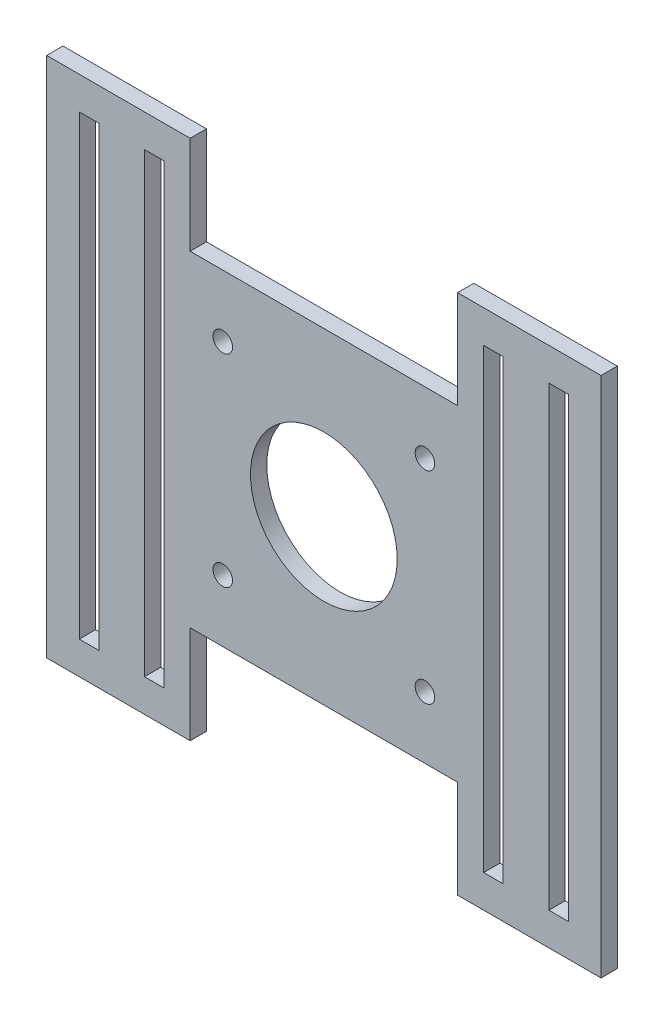
ISO-10303-21;
HEADER;
FILE_DESCRIPTION(('STEP AP214'),'2;1');
FILE_NAME('part.step','',(''),(''),'','','');
FILE_SCHEMA(('AUTOMOTIVE_DESIGN { 1 0 10303 214 1 1 1 1 }'));
ENDSEC;
DATA;
#1=APPLICATION_CONTEXT('core data for automotive mechanical design processes');
#2=APPLICATION_PROTOCOL_DEFINITION('international standard','automotive_design',2000,#1);
#3=PRODUCT_CONTEXT('',#1,'mechanical');
#4=PRODUCT('Part','Part','',(#3));
#5=PRODUCT_RELATED_PRODUCT_CATEGORY('part','',(#4));
#6=PRODUCT_DEFINITION_FORMATION('','',#4);
#7=PRODUCT_DEFINITION_CONTEXT('part definition',#1,'design');
#8=PRODUCT_DEFINITION('design','',#6,#7);
#9=PRODUCT_DEFINITION_SHAPE('','',#8);
#10=(LENGTH_UNIT() NAMED_UNIT(*) SI_UNIT(.MILLI.,.METRE.));
#11=(NAMED_UNIT(*) PLANE_ANGLE_UNIT() SI_UNIT($,.RADIAN.));
#12=(NAMED_UNIT(*) SI_UNIT($,.STERADIAN.) SOLID_ANGLE_UNIT());
#13=UNCERTAINTY_MEASURE_WITH_UNIT(LENGTH_MEASURE(1.E-05),#10,'distance_accuracy_value','');
#14=(GEOMETRIC_REPRESENTATION_CONTEXT(3) GLOBAL_UNCERTAINTY_ASSIGNED_CONTEXT((#13)) GLOBAL_UNIT_ASSIGNED_CONTEXT((#10,
#11,#12)) REPRESENTATION_CONTEXT('',''));
#15=CARTESIAN_POINT('',(0.,0.,0.));
#16=DIRECTION('',(0.,0.,1.));
#17=DIRECTION('',(1.,0.,0.));
#18=AXIS2_PLACEMENT_3D('',#15,#16,#17);
#19=CARTESIAN_POINT('',(0.,0.,2.5));
#20=DIRECTION('',(0.,1.,0.));
#21=DIRECTION('',(0.,0.,1.));
#22=AXIS2_PLACEMENT_3D('',#19,#20,#21);
#23=PLANE('',#22);
#24=DIRECTION('',(0.,0.,-1.));
#25=VECTOR('',#24,1.);
#26=CARTESIAN_POINT('',(63.,0.,2.5));
#27=LINE('',#26,#25);
#28=CARTESIAN_POINT('',(63.,0.,2.5));
#29=VERTEX_POINT('',#28);
#30=CARTESIAN_POINT('',(63.,0.,0.));
#31=VERTEX_POINT('',#30);
#32=EDGE_CURVE('E369',#29,#31,#27,.T.);
#33=ORIENTED_EDGE('',*,*,#32,.F.);
#34=DIRECTION('',(1.,0.,0.));
#35=VECTOR('',#34,1.);
#36=CARTESIAN_POINT('',(0.,0.,2.5));
#37=LINE('',#36,#35);
#38=CARTESIAN_POINT('',(22.,0.,2.5));
#39=VERTEX_POINT('',#38);
#40=EDGE_CURVE('E397',#39,#29,#37,.T.);
#41=ORIENTED_EDGE('',*,*,#40,.F.);
#42=DIRECTION('',(0.,0.,-1.));
#43=VECTOR('',#42,1.);
#44=CARTESIAN_POINT('',(22.,0.,2.5));
#45=LINE('',#44,#43);
#46=CARTESIAN_POINT('',(22.,0.,0.));
#47=VERTEX_POINT('',#46);
#48=EDGE_CURVE('E393',#39,#47,#45,.T.);
#49=ORIENTED_EDGE('',*,*,#48,.T.);
#50=DIRECTION('',(1.,0.,0.));
#51=VECTOR('',#50,1.);
#52=CARTESIAN_POINT('',(0.,0.,0.));
#53=LINE('',#52,#51);
#54=EDGE_CURVE('E524',#47,#31,#53,.T.);
#55=ORIENTED_EDGE('',*,*,#54,.T.);
#56=EDGE_LOOP('',(#33,#41,#49,#55));
#57=FACE_BOUND('',#56,.T.);
#58=ADVANCED_FACE('F39',(#57),#23,.F.);
#59=CARTESIAN_POINT('',(0.,50.,2.5));
#60=DIRECTION('',(0.,-1.,0.));
#61=DIRECTION('',(0.,0.,-1.));
#62=AXIS2_PLACEMENT_3D('',#59,#60,#61);
#63=PLANE('',#62);
#64=DIRECTION('',(0.,0.,-1.));
#65=VECTOR('',#64,1.);
#66=CARTESIAN_POINT('',(63.,50.,2.5));
#67=LINE('',#66,#65);
#68=CARTESIAN_POINT('',(63.,50.,2.5));
#69=VERTEX_POINT('',#68);
#70=CARTESIAN_POINT('',(63.,50.,0.));
#71=VERTEX_POINT('',#70);
#72=EDGE_CURVE('E494',#69,#71,#67,.T.);
#73=ORIENTED_EDGE('',*,*,#72,.T.);
#74=DIRECTION('',(-1.,0.,0.));
#75=VECTOR('',#74,1.);
#76=CARTESIAN_POINT('',(0.,50.,0.));
#77=LINE('',#76,#75);
#78=CARTESIAN_POINT('',(22.,50.,0.));
#79=VERTEX_POINT('',#78);
#80=EDGE_CURVE('E467',#71,#79,#77,.T.);
#81=ORIENTED_EDGE('',*,*,#80,.T.);
#82=DIRECTION('',(0.,0.,-1.));
#83=VECTOR('',#82,1.);
#84=CARTESIAN_POINT('',(22.,50.,2.5));
#85=LINE('',#84,#83);
#86=CARTESIAN_POINT('',(22.,50.,2.5));
#87=VERTEX_POINT('',#86);
#88=EDGE_CURVE('E508',#87,#79,#85,.T.);
#89=ORIENTED_EDGE('',*,*,#88,.F.);
#90=DIRECTION('',(-1.,0.,0.));
#91=VECTOR('',#90,1.);
#92=CARTESIAN_POINT('',(0.,50.,2.5));
#93=LINE('',#92,#91);
#94=EDGE_CURVE('E11',#69,#87,#93,.T.);
#95=ORIENTED_EDGE('',*,*,#94,.F.);
#96=EDGE_LOOP('',(#73,#81,#89,#95));
#97=FACE_BOUND('',#96,.T.);
#98=ADVANCED_FACE('F561',(#97),#63,.F.);
#99=CARTESIAN_POINT('',(0.,0.,2.5));
#100=DIRECTION('',(1.,0.,0.));
#101=DIRECTION('',(0.,0.,-1.));
#102=AXIS2_PLACEMENT_3D('',#99,#100,#101);
#103=PLANE('',#102);
#104=DIRECTION('',(0.,-1.,0.));
#105=VECTOR('',#104,1.);
#106=CARTESIAN_POINT('',(0.,0.,0.));
#107=LINE('',#106,#105);
#108=CARTESIAN_POINT('',(0.,65.,0.));
#109=VERTEX_POINT('',#108);
#110=CARTESIAN_POINT('',(0.,-15.,0.));
#111=VERTEX_POINT('',#110);
#112=EDGE_CURVE('E475',#109,#111,#107,.T.);
#113=ORIENTED_EDGE('',*,*,#112,.T.);
#114=DIRECTION('',(0.,0.,-1.));
#115=VECTOR('',#114,1.);
#116=CARTESIAN_POINT('',(0.,-15.,2.5));
#117=LINE('',#116,#115);
#118=CARTESIAN_POINT('',(0.,-15.,2.5));
#119=VERTEX_POINT('',#118);
#120=EDGE_CURVE('E472',#119,#111,#117,.T.);
#121=ORIENTED_EDGE('',*,*,#120,.F.);
#122=DIRECTION('',(0.,-1.,0.));
#123=VECTOR('',#122,1.);
#124=CARTESIAN_POINT('',(0.,0.,2.5));
#125=LINE('',#124,#123);
#126=CARTESIAN_POINT('',(0.,65.,2.5));
#127=VERTEX_POINT('',#126);
#128=EDGE_CURVE('E458',#127,#119,#125,.T.);
#129=ORIENTED_EDGE('',*,*,#128,.F.);
#130=DIRECTION('',(0.,0.,-1.));
#131=VECTOR('',#130,1.);
#132=CARTESIAN_POINT('',(0.,65.,2.5));
#133=LINE('',#132,#131);
#134=EDGE_CURVE('E499',#127,#109,#133,.T.);
#135=ORIENTED_EDGE('',*,*,#134,.T.);
#136=EDGE_LOOP('',(#113,#121,#129,#135));
#137=FACE_BOUND('',#136,.T.);
#138=ADVANCED_FACE('F41',(#137),#103,.F.);
#139=CARTESIAN_POINT('',(85.,0.,2.5));
#140=DIRECTION('',(-1.,0.,0.));
#141=DIRECTION('',(0.,0.,1.));
#142=AXIS2_PLACEMENT_3D('',#139,#140,#141);
#143=PLANE('',#142);
#144=DIRECTION('',(0.,1.,0.));
#145=VECTOR('',#144,1.);
#146=CARTESIAN_POINT('',(85.,0.,0.));
#147=LINE('',#146,#145);
#148=CARTESIAN_POINT('',(85.,-15.,0.));
#149=VERTEX_POINT('',#148);
#150=CARTESIAN_POINT('',(85.,65.,0.));
#151=VERTEX_POINT('',#150);
#152=EDGE_CURVE('E522',#149,#151,#147,.T.);
#153=ORIENTED_EDGE('',*,*,#152,.T.);
#154=DIRECTION('',(0.,0.,-1.));
#155=VECTOR('',#154,1.);
#156=CARTESIAN_POINT('',(85.,65.,2.5));
#157=LINE('',#156,#155);
#158=CARTESIAN_POINT('',(85.,65.,2.5));
#159=VERTEX_POINT('',#158);
#160=EDGE_CURVE('E491',#159,#151,#157,.T.);
#161=ORIENTED_EDGE('',*,*,#160,.F.);
#162=DIRECTION('',(0.,1.,0.));
#163=VECTOR('',#162,1.);
#164=CARTESIAN_POINT('',(85.,0.,2.5));
#165=LINE('',#164,#163);
#166=CARTESIAN_POINT('',(85.,-15.,2.5));
#167=VERTEX_POINT('',#166);
#168=EDGE_CURVE('E48',#167,#159,#165,.T.);
#169=ORIENTED_EDGE('',*,*,#168,.F.);
#170=DIRECTION('',(0.,0.,-1.));
#171=VECTOR('',#170,1.);
#172=CARTESIAN_POINT('',(85.,-15.,2.5));
#173=LINE('',#172,#171);
#174=EDGE_CURVE('E376',#167,#149,#173,.T.);
#175=ORIENTED_EDGE('',*,*,#174,.T.);
#176=EDGE_LOOP('',(#153,#161,#169,#175));
#177=FACE_BOUND('',#176,.T.);
#178=ADVANCED_FACE('F437',(#177),#143,.F.);
#179=CARTESIAN_POINT('',(0.,0.,2.5));
#180=DIRECTION('',(0.,0.,-1.));
#181=DIRECTION('',(-1.,0.,0.));
#182=AXIS2_PLACEMENT_3D('',#179,#180,#181);
#183=PLANE('',#182);
#184=CARTESIAN_POINT('',(58.,9.5,2.5));
#185=DIRECTION('',(0.,0.,1.));
#186=DIRECTION('',(1.,0.,0.));
#187=AXIS2_PLACEMENT_3D('',#184,#185,#186);
#188=CIRCLE('',#187,1.5);
#189=CARTESIAN_POINT('',(59.5,9.5,2.5));
#190=VERTEX_POINT('',#189);
#191=EDGE_CURVE('E427',#190,#190,#188,.T.);
#192=ORIENTED_EDGE('',*,*,#191,.F.);
#193=EDGE_LOOP('',(#192));
#194=FACE_BOUND('',#193,.T.);
#195=CARTESIAN_POINT('',(58.,40.5,2.5));
#196=DIRECTION('',(0.,0.,1.));
#197=DIRECTION('',(1.,0.,0.));
#198=AXIS2_PLACEMENT_3D('',#195,#196,#197);
#199=CIRCLE('',#198,1.5);
#200=CARTESIAN_POINT('',(59.5,40.5,2.5));
#201=VERTEX_POINT('',#200);
#202=EDGE_CURVE('E417',#201,#201,#199,.T.);
#203=ORIENTED_EDGE('',*,*,#202,.F.);
#204=EDGE_LOOP('',(#203));
#205=FACE_BOUND('',#204,.T.);
#206=CARTESIAN_POINT('',(27.,9.5,2.5));
#207=DIRECTION('',(0.,0.,1.));
#208=DIRECTION('',(1.,0.,0.));
#209=AXIS2_PLACEMENT_3D('',#206,#207,#208);
#210=CIRCLE('',#209,1.5);
#211=CARTESIAN_POINT('',(28.5,9.5,2.5));
#212=VERTEX_POINT('',#211);
#213=EDGE_CURVE('E414',#212,#212,#210,.T.);
#214=ORIENTED_EDGE('',*,*,#213,.F.);
#215=EDGE_LOOP('',(#214));
#216=FACE_BOUND('',#215,.T.);
#217=CARTESIAN_POINT('',(27.,40.5,2.5));
#218=DIRECTION('',(0.,0.,1.));
#219=DIRECTION('',(1.,0.,0.));
#220=AXIS2_PLACEMENT_3D('',#217,#218,#219);
#221=CIRCLE('',#220,1.5);
#222=CARTESIAN_POINT('',(28.5,40.5,2.5));
#223=VERTEX_POINT('',#222);
#224=EDGE_CURVE('E411',#223,#223,#221,.T.);
#225=ORIENTED_EDGE('',*,*,#224,.F.);
#226=EDGE_LOOP('',(#225));
#227=FACE_BOUND('',#226,.T.);
#228=CARTESIAN_POINT('',(42.5,25.,2.5));
#229=DIRECTION('',(0.,0.,1.));
#230=DIRECTION('',(1.,0.,0.));
#231=AXIS2_PLACEMENT_3D('',#228,#229,#230);
#232=CIRCLE('',#231,11.25);
#233=CARTESIAN_POINT('',(53.75,25.,2.5));
#234=VERTEX_POINT('',#233);
#235=EDGE_CURVE('E249',#234,#234,#232,.T.);
#236=ORIENTED_EDGE('',*,*,#235,.F.);
#237=EDGE_LOOP('',(#236));
#238=FACE_BOUND('',#237,.T.);
#239=DIRECTION('',(1.,0.,0.));
#240=VECTOR('',#239,1.);
#241=CARTESIAN_POINT('',(77.,-10.,2.5));
#242=LINE('',#241,#240);
#243=CARTESIAN_POINT('',(77.,-10.,2.5));
#244=VERTEX_POINT('',#243);
#245=CARTESIAN_POINT('',(80.,-10.,2.5));
#246=VERTEX_POINT('',#245);
#247=EDGE_CURVE('E255',#244,#246,#242,.T.);
#248=ORIENTED_EDGE('',*,*,#247,.F.);
#249=DIRECTION('',(0.,-1.,0.));
#250=VECTOR('',#249,1.);
#251=CARTESIAN_POINT('',(77.,-10.,2.5));
#252=LINE('',#251,#250);
#253=CARTESIAN_POINT('',(77.,60.,2.5));
#254=VERTEX_POINT('',#253);
#255=EDGE_CURVE('E56',#254,#244,#252,.T.);
#256=ORIENTED_EDGE('',*,*,#255,.F.);
#257=DIRECTION('',(-1.,0.,0.));
#258=VECTOR('',#257,1.);
#259=CARTESIAN_POINT('',(77.,60.,2.5));
#260=LINE('',#259,#258);
#261=CARTESIAN_POINT('',(80.,60.,2.5));
#262=VERTEX_POINT('',#261);
#263=EDGE_CURVE('E243',#262,#254,#260,.T.);
#264=ORIENTED_EDGE('',*,*,#263,.F.);
#265=DIRECTION('',(0.,1.,0.));
#266=VECTOR('',#265,1.);
#267=CARTESIAN_POINT('',(80.,-10.,2.5));
#268=LINE('',#267,#266);
#269=EDGE_CURVE('E246',#246,#262,#268,.T.);
#270=ORIENTED_EDGE('',*,*,#269,.F.);
#271=EDGE_LOOP('',(#248,#256,#264,#270));
#272=FACE_BOUND('',#271,.T.);
#273=DIRECTION('',(1.,0.,0.));
#274=VECTOR('',#273,1.);
#275=CARTESIAN_POINT('',(67.,-10.,2.5));
#276=LINE('',#275,#274);
#277=CARTESIAN_POINT('',(67.,-10.,2.5));
#278=VERTEX_POINT('',#277);
#279=CARTESIAN_POINT('',(70.,-10.,2.5));
#280=VERTEX_POINT('',#279);
#281=EDGE_CURVE('E281',#278,#280,#276,.T.);
#282=ORIENTED_EDGE('',*,*,#281,.F.);
#283=DIRECTION('',(0.,-1.,0.));
#284=VECTOR('',#283,1.);
#285=CARTESIAN_POINT('',(67.,60.,2.5));
#286=LINE('',#285,#284);
#287=CARTESIAN_POINT('',(67.,60.,2.5));
#288=VERTEX_POINT('',#287);
#289=EDGE_CURVE('E262',#288,#278,#286,.T.);
#290=ORIENTED_EDGE('',*,*,#289,.F.);
#291=DIRECTION('',(-1.,0.,0.));
#292=VECTOR('',#291,1.);
#293=CARTESIAN_POINT('',(67.,60.,2.5));
#294=LINE('',#293,#292);
#295=CARTESIAN_POINT('',(70.,60.,2.5));
#296=VERTEX_POINT('',#295);
#297=EDGE_CURVE('E270',#296,#288,#294,.T.);
#298=ORIENTED_EDGE('',*,*,#297,.F.);
#299=DIRECTION('',(0.,1.,0.));
#300=VECTOR('',#299,1.);
#301=CARTESIAN_POINT('',(70.,60.,2.5));
#302=LINE('',#301,#300);
#303=EDGE_CURVE('E284',#280,#296,#302,.T.);
#304=ORIENTED_EDGE('',*,*,#303,.F.);
#305=EDGE_LOOP('',(#282,#290,#298,#304));
#306=FACE_BOUND('',#305,.T.);
#307=DIRECTION('',(1.,0.,0.));
#308=VECTOR('',#307,1.);
#309=CARTESIAN_POINT('',(15.,-10.,2.5));
#310=LINE('',#309,#308);
#311=CARTESIAN_POINT('',(15.,-10.,2.5));
#312=VERTEX_POINT('',#311);
#313=CARTESIAN_POINT('',(18.,-10.,2.5));
#314=VERTEX_POINT('',#313);
#315=EDGE_CURVE('E313',#312,#314,#310,.T.);
#316=ORIENTED_EDGE('',*,*,#315,.F.);
#317=DIRECTION('',(0.,-1.,0.));
#318=VECTOR('',#317,1.);
#319=CARTESIAN_POINT('',(15.,-10.,2.5));
#320=LINE('',#319,#318);
#321=CARTESIAN_POINT('',(15.,60.,2.5));
#322=VERTEX_POINT('',#321);
#323=EDGE_CURVE('E291',#322,#312,#320,.T.);
#324=ORIENTED_EDGE('',*,*,#323,.F.);
#325=DIRECTION('',(-1.,0.,0.));
#326=VECTOR('',#325,1.);
#327=CARTESIAN_POINT('',(15.,60.,2.5));
#328=LINE('',#327,#326);
#329=CARTESIAN_POINT('',(18.,60.,2.5));
#330=VERTEX_POINT('',#329);
#331=EDGE_CURVE('E302',#330,#322,#328,.T.);
#332=ORIENTED_EDGE('',*,*,#331,.F.);
#333=DIRECTION('',(0.,1.,0.));
#334=VECTOR('',#333,1.);
#335=CARTESIAN_POINT('',(18.,-10.,2.5));
#336=LINE('',#335,#334);
#337=EDGE_CURVE('E316',#314,#330,#336,.T.);
#338=ORIENTED_EDGE('',*,*,#337,.F.);
#339=EDGE_LOOP('',(#316,#324,#332,#338));
#340=FACE_BOUND('',#339,.T.);
#341=DIRECTION('',(1.,0.,0.));
#342=VECTOR('',#341,1.);
#343=CARTESIAN_POINT('',(5.00000000000001,-10.,2.5));
#344=LINE('',#343,#342);
#345=CARTESIAN_POINT('',(5.00000000000001,-10.,2.5));
#346=VERTEX_POINT('',#345);
#347=CARTESIAN_POINT('',(8.00000000000001,-10.,2.5));
#348=VERTEX_POINT('',#347);
#349=EDGE_CURVE('E345',#346,#348,#344,.T.);
#350=ORIENTED_EDGE('',*,*,#349,.F.);
#351=DIRECTION('',(0.,-1.,0.));
#352=VECTOR('',#351,1.);
#353=CARTESIAN_POINT('',(5.,60.,2.5));
#354=LINE('',#353,#352);
#355=CARTESIAN_POINT('',(5.,60.,2.5));
#356=VERTEX_POINT('',#355);
#357=EDGE_CURVE('E323',#356,#346,#354,.T.);
#358=ORIENTED_EDGE('',*,*,#357,.F.);
#359=DIRECTION('',(-1.,0.,0.));
#360=VECTOR('',#359,1.);
#361=CARTESIAN_POINT('',(5.,60.,2.5));
#362=LINE('',#361,#360);
#363=CARTESIAN_POINT('',(8.,60.,2.5));
#364=VERTEX_POINT('',#363);
#365=EDGE_CURVE('E334',#364,#356,#362,.T.);
#366=ORIENTED_EDGE('',*,*,#365,.F.);
#367=DIRECTION('',(0.,1.,0.));
#368=VECTOR('',#367,1.);
#369=CARTESIAN_POINT('',(8.,60.,2.5));
#370=LINE('',#369,#368);
#371=EDGE_CURVE('E348',#348,#364,#370,.T.);
#372=ORIENTED_EDGE('',*,*,#371,.F.);
#373=EDGE_LOOP('',(#350,#358,#366,#372));
#374=FACE_BOUND('',#373,.T.);
#375=ORIENTED_EDGE('',*,*,#128,.T.);
#376=DIRECTION('',(1.,0.,0.));
#377=VECTOR('',#376,1.);
#378=CARTESIAN_POINT('',(0.,-15.,2.5));
#379=LINE('',#378,#377);
#380=CARTESIAN_POINT('',(22.,-15.,2.5));
#381=VERTEX_POINT('',#380);
#382=EDGE_CURVE('E383',#119,#381,#379,.T.);
#383=ORIENTED_EDGE('',*,*,#382,.T.);
#384=DIRECTION('',(0.,1.,0.));
#385=VECTOR('',#384,1.);
#386=CARTESIAN_POINT('',(22.,-15.,2.5));
#387=LINE('',#386,#385);
#388=EDGE_CURVE('E385',#381,#39,#387,.T.);
#389=ORIENTED_EDGE('',*,*,#388,.T.);
#390=ORIENTED_EDGE('',*,*,#40,.T.);
#391=DIRECTION('',(0.,-1.,0.));
#392=VECTOR('',#391,1.);
#393=CARTESIAN_POINT('',(63.,-15.,2.5));
#394=LINE('',#393,#392);
#395=CARTESIAN_POINT('',(63.,-15.,2.5));
#396=VERTEX_POINT('',#395);
#397=EDGE_CURVE('E362',#29,#396,#394,.T.);
#398=ORIENTED_EDGE('',*,*,#397,.T.);
#399=DIRECTION('',(1.,0.,0.));
#400=VECTOR('',#399,1.);
#401=CARTESIAN_POINT('',(63.,-15.,2.5));
#402=LINE('',#401,#400);
#403=EDGE_CURVE('E365',#396,#167,#402,.T.);
#404=ORIENTED_EDGE('',*,*,#403,.T.);
#405=ORIENTED_EDGE('',*,*,#168,.T.);
#406=DIRECTION('',(-1.,0.,0.));
#407=VECTOR('',#406,1.);
#408=CARTESIAN_POINT('',(63.,65.,2.5));
#409=LINE('',#408,#407);
#410=CARTESIAN_POINT('',(63.,65.,2.5));
#411=VERTEX_POINT('',#410);
#412=EDGE_CURVE('E485',#159,#411,#409,.T.);
#413=ORIENTED_EDGE('',*,*,#412,.T.);
#414=DIRECTION('',(0.,-1.,0.));
#415=VECTOR('',#414,1.);
#416=CARTESIAN_POINT('',(63.,50.,2.5));
#417=LINE('',#416,#415);
#418=EDGE_CURVE('E482',#411,#69,#417,.T.);
#419=ORIENTED_EDGE('',*,*,#418,.T.);
#420=ORIENTED_EDGE('',*,*,#94,.T.);
#421=DIRECTION('',(0.,1.,0.));
#422=VECTOR('',#421,1.);
#423=CARTESIAN_POINT('',(22.,50.,2.5));
#424=LINE('',#423,#422);
#425=CARTESIAN_POINT('',(22.,65.,2.5));
#426=VERTEX_POINT('',#425);
#427=EDGE_CURVE('E500',#87,#426,#424,.T.);
#428=ORIENTED_EDGE('',*,*,#427,.T.);
#429=DIRECTION('',(-1.,0.,0.));
#430=VECTOR('',#429,1.);
#431=CARTESIAN_POINT('',(0.,65.,2.5));
#432=LINE('',#431,#430);
#433=EDGE_CURVE('E462',#426,#127,#432,.T.);
#434=ORIENTED_EDGE('',*,*,#433,.T.);
#435=EDGE_LOOP('',(#375,#383,#389,#390,#398,#404,#405,#413,#419,#420,#428,#434));
#436=FACE_BOUND('',#435,.T.);
#437=ADVANCED_FACE('F434',(#194,#205,#216,#227,#238,#272,#306,#340,#374,#436),#183,.F.);
#438=CARTESIAN_POINT('',(0.,0.,0.));
#439=DIRECTION('',(0.,0.,-1.));
#440=DIRECTION('',(-1.,0.,0.));
#441=AXIS2_PLACEMENT_3D('',#438,#439,#440);
#442=PLANE('',#441);
#443=CARTESIAN_POINT('',(58.,9.5,0.));
#444=DIRECTION('',(0.,0.,-1.));
#445=DIRECTION('',(-1.,0.,0.));
#446=AXIS2_PLACEMENT_3D('',#443,#444,#445);
#447=CIRCLE('',#446,1.5);
#448=CARTESIAN_POINT('',(56.5,9.5,0.));
#449=VERTEX_POINT('',#448);
#450=EDGE_CURVE('E43',#449,#449,#447,.T.);
#451=ORIENTED_EDGE('',*,*,#450,.F.);
#452=EDGE_LOOP('',(#451));
#453=FACE_BOUND('',#452,.T.);
#454=CARTESIAN_POINT('',(58.,40.5,0.));
#455=DIRECTION('',(0.,0.,-1.));
#456=DIRECTION('',(-1.,0.,0.));
#457=AXIS2_PLACEMENT_3D('',#454,#455,#456);
#458=CIRCLE('',#457,1.5);
#459=CARTESIAN_POINT('',(56.5,40.5,0.));
#460=VERTEX_POINT('',#459);
#461=EDGE_CURVE('E415',#460,#460,#458,.T.);
#462=ORIENTED_EDGE('',*,*,#461,.F.);
#463=EDGE_LOOP('',(#462));
#464=FACE_BOUND('',#463,.T.);
#465=CARTESIAN_POINT('',(27.,9.5,0.));
#466=DIRECTION('',(0.,0.,-1.));
#467=DIRECTION('',(-1.,0.,0.));
#468=AXIS2_PLACEMENT_3D('',#465,#466,#467);
#469=CIRCLE('',#468,1.5);
#470=CARTESIAN_POINT('',(25.5,9.5,0.));
#471=VERTEX_POINT('',#470);
#472=EDGE_CURVE('E412',#471,#471,#469,.T.);
#473=ORIENTED_EDGE('',*,*,#472,.F.);
#474=EDGE_LOOP('',(#473));
#475=FACE_BOUND('',#474,.T.);
#476=CARTESIAN_POINT('',(27.,40.5,0.));
#477=DIRECTION('',(0.,0.,-1.));
#478=DIRECTION('',(-1.,0.,0.));
#479=AXIS2_PLACEMENT_3D('',#476,#477,#478);
#480=CIRCLE('',#479,1.5);
#481=CARTESIAN_POINT('',(25.5,40.5,0.));
#482=VERTEX_POINT('',#481);
#483=EDGE_CURVE('E408',#482,#482,#480,.T.);
#484=ORIENTED_EDGE('',*,*,#483,.F.);
#485=EDGE_LOOP('',(#484));
#486=FACE_BOUND('',#485,.T.);
#487=CARTESIAN_POINT('',(42.5,25.,0.));
#488=DIRECTION('',(0.,0.,-1.));
#489=DIRECTION('',(-1.,0.,0.));
#490=AXIS2_PLACEMENT_3D('',#487,#488,#489);
#491=CIRCLE('',#490,11.25);
#492=CARTESIAN_POINT('',(31.25,25.,0.));
#493=VERTEX_POINT('',#492);
#494=EDGE_CURVE('E256',#493,#493,#491,.T.);
#495=ORIENTED_EDGE('',*,*,#494,.F.);
#496=EDGE_LOOP('',(#495));
#497=FACE_BOUND('',#496,.T.);
#498=DIRECTION('',(0.,-1.,0.));
#499=VECTOR('',#498,1.);
#500=CARTESIAN_POINT('',(77.,-10.,0.));
#501=LINE('',#500,#499);
#502=CARTESIAN_POINT('',(77.,60.,0.));
#503=VERTEX_POINT('',#502);
#504=CARTESIAN_POINT('',(77.,-10.,0.));
#505=VERTEX_POINT('',#504);
#506=EDGE_CURVE('E227',#503,#505,#501,.T.);
#507=ORIENTED_EDGE('',*,*,#506,.T.);
#508=DIRECTION('',(1.,0.,0.));
#509=VECTOR('',#508,1.);
#510=CARTESIAN_POINT('',(77.,-10.,0.));
#511=LINE('',#510,#509);
#512=CARTESIAN_POINT('',(80.,-10.,0.));
#513=VERTEX_POINT('',#512);
#514=EDGE_CURVE('E236',#505,#513,#511,.T.);
#515=ORIENTED_EDGE('',*,*,#514,.T.);
#516=DIRECTION('',(0.,1.,0.));
#517=VECTOR('',#516,1.);
#518=CARTESIAN_POINT('',(80.,-10.,0.));
#519=LINE('',#518,#517);
#520=CARTESIAN_POINT('',(80.,60.,0.));
#521=VERTEX_POINT('',#520);
#522=EDGE_CURVE('E64',#513,#521,#519,.T.);
#523=ORIENTED_EDGE('',*,*,#522,.T.);
#524=DIRECTION('',(-1.,0.,0.));
#525=VECTOR('',#524,1.);
#526=CARTESIAN_POINT('',(77.,60.,0.));
#527=LINE('',#526,#525);
#528=EDGE_CURVE('E233',#521,#503,#527,.T.);
#529=ORIENTED_EDGE('',*,*,#528,.T.);
#530=EDGE_LOOP('',(#507,#515,#523,#529));
#531=FACE_BOUND('',#530,.T.);
#532=DIRECTION('',(0.,-1.,0.));
#533=VECTOR('',#532,1.);
#534=CARTESIAN_POINT('',(67.,60.,0.));
#535=LINE('',#534,#533);
#536=CARTESIAN_POINT('',(67.,60.,0.));
#537=VERTEX_POINT('',#536);
#538=CARTESIAN_POINT('',(67.,-10.,0.));
#539=VERTEX_POINT('',#538);
#540=EDGE_CURVE('E266',#537,#539,#535,.T.);
#541=ORIENTED_EDGE('',*,*,#540,.T.);
#542=DIRECTION('',(1.,0.,0.));
#543=VECTOR('',#542,1.);
#544=CARTESIAN_POINT('',(67.,-10.,0.));
#545=LINE('',#544,#543);
#546=CARTESIAN_POINT('',(70.,-10.,0.));
#547=VERTEX_POINT('',#546);
#548=EDGE_CURVE('E269',#539,#547,#545,.T.);
#549=ORIENTED_EDGE('',*,*,#548,.T.);
#550=DIRECTION('',(0.,1.,0.));
#551=VECTOR('',#550,1.);
#552=CARTESIAN_POINT('',(70.,60.,0.));
#553=LINE('',#552,#551);
#554=CARTESIAN_POINT('',(70.,60.,0.));
#555=VERTEX_POINT('',#554);
#556=EDGE_CURVE('E273',#547,#555,#553,.T.);
#557=ORIENTED_EDGE('',*,*,#556,.T.);
#558=DIRECTION('',(-1.,0.,0.));
#559=VECTOR('',#558,1.);
#560=CARTESIAN_POINT('',(67.,60.,0.));
#561=LINE('',#560,#559);
#562=EDGE_CURVE('E276',#555,#537,#561,.T.);
#563=ORIENTED_EDGE('',*,*,#562,.T.);
#564=EDGE_LOOP('',(#541,#549,#557,#563));
#565=FACE_BOUND('',#564,.T.);
#566=DIRECTION('',(0.,-1.,0.));
#567=VECTOR('',#566,1.);
#568=CARTESIAN_POINT('',(15.,-10.,0.));
#569=LINE('',#568,#567);
#570=CARTESIAN_POINT('',(15.,60.,0.));
#571=VERTEX_POINT('',#570);
#572=CARTESIAN_POINT('',(15.,-10.,0.));
#573=VERTEX_POINT('',#572);
#574=EDGE_CURVE('E298',#571,#573,#569,.T.);
#575=ORIENTED_EDGE('',*,*,#574,.T.);
#576=DIRECTION('',(1.,0.,0.));
#577=VECTOR('',#576,1.);
#578=CARTESIAN_POINT('',(15.,-10.,0.));
#579=LINE('',#578,#577);
#580=CARTESIAN_POINT('',(18.,-10.,0.));
#581=VERTEX_POINT('',#580);
#582=EDGE_CURVE('E301',#573,#581,#579,.T.);
#583=ORIENTED_EDGE('',*,*,#582,.T.);
#584=DIRECTION('',(0.,1.,0.));
#585=VECTOR('',#584,1.);
#586=CARTESIAN_POINT('',(18.,-10.,0.));
#587=LINE('',#586,#585);
#588=CARTESIAN_POINT('',(18.,60.,0.));
#589=VERTEX_POINT('',#588);
#590=EDGE_CURVE('E305',#581,#589,#587,.T.);
#591=ORIENTED_EDGE('',*,*,#590,.T.);
#592=DIRECTION('',(-1.,0.,0.));
#593=VECTOR('',#592,1.);
#594=CARTESIAN_POINT('',(15.,60.,0.));
#595=LINE('',#594,#593);
#596=EDGE_CURVE('E308',#589,#571,#595,.T.);
#597=ORIENTED_EDGE('',*,*,#596,.T.);
#598=EDGE_LOOP('',(#575,#583,#591,#597));
#599=FACE_BOUND('',#598,.T.);
#600=DIRECTION('',(0.,-1.,0.));
#601=VECTOR('',#600,1.);
#602=CARTESIAN_POINT('',(5.,60.,0.));
#603=LINE('',#602,#601);
#604=CARTESIAN_POINT('',(5.,60.,0.));
#605=VERTEX_POINT('',#604);
#606=CARTESIAN_POINT('',(5.00000000000001,-10.,0.));
#607=VERTEX_POINT('',#606);
#608=EDGE_CURVE('E330',#605,#607,#603,.T.);
#609=ORIENTED_EDGE('',*,*,#608,.T.);
#610=DIRECTION('',(1.,0.,0.));
#611=VECTOR('',#610,1.);
#612=CARTESIAN_POINT('',(5.00000000000001,-10.,0.));
#613=LINE('',#612,#611);
#614=CARTESIAN_POINT('',(8.00000000000001,-10.,0.));
#615=VERTEX_POINT('',#614);
#616=EDGE_CURVE('E333',#607,#615,#613,.T.);
#617=ORIENTED_EDGE('',*,*,#616,.T.);
#618=DIRECTION('',(0.,1.,0.));
#619=VECTOR('',#618,1.);
#620=CARTESIAN_POINT('',(8.,60.,0.));
#621=LINE('',#620,#619);
#622=CARTESIAN_POINT('',(8.,60.,0.));
#623=VERTEX_POINT('',#622);
#624=EDGE_CURVE('E337',#615,#623,#621,.T.);
#625=ORIENTED_EDGE('',*,*,#624,.T.);
#626=DIRECTION('',(-1.,0.,0.));
#627=VECTOR('',#626,1.);
#628=CARTESIAN_POINT('',(5.,60.,0.));
#629=LINE('',#628,#627);
#630=EDGE_CURVE('E340',#623,#605,#629,.T.);
#631=ORIENTED_EDGE('',*,*,#630,.T.);
#632=EDGE_LOOP('',(#609,#617,#625,#631));
#633=FACE_BOUND('',#632,.T.);
#634=ORIENTED_EDGE('',*,*,#112,.F.);
#635=DIRECTION('',(-1.,0.,0.));
#636=VECTOR('',#635,1.);
#637=CARTESIAN_POINT('',(0.,65.,0.));
#638=LINE('',#637,#636);
#639=CARTESIAN_POINT('',(22.,65.,0.));
#640=VERTEX_POINT('',#639);
#641=EDGE_CURVE('E501',#640,#109,#638,.T.);
#642=ORIENTED_EDGE('',*,*,#641,.F.);
#643=DIRECTION('',(0.,1.,0.));
#644=VECTOR('',#643,1.);
#645=CARTESIAN_POINT('',(22.,50.,0.));
#646=LINE('',#645,#644);
#647=EDGE_CURVE('E497',#79,#640,#646,.T.);
#648=ORIENTED_EDGE('',*,*,#647,.F.);
#649=ORIENTED_EDGE('',*,*,#80,.F.);
#650=DIRECTION('',(0.,-1.,0.));
#651=VECTOR('',#650,1.);
#652=CARTESIAN_POINT('',(63.,50.,0.));
#653=LINE('',#652,#651);
#654=CARTESIAN_POINT('',(63.,65.,0.));
#655=VERTEX_POINT('',#654);
#656=EDGE_CURVE('E477',#655,#71,#653,.T.);
#657=ORIENTED_EDGE('',*,*,#656,.F.);
#658=DIRECTION('',(-1.,0.,0.));
#659=VECTOR('',#658,1.);
#660=CARTESIAN_POINT('',(63.,65.,0.));
#661=LINE('',#660,#659);
#662=EDGE_CURVE('E479',#151,#655,#661,.T.);
#663=ORIENTED_EDGE('',*,*,#662,.F.);
#664=ORIENTED_EDGE('',*,*,#152,.F.);
#665=DIRECTION('',(1.,0.,0.));
#666=VECTOR('',#665,1.);
#667=CARTESIAN_POINT('',(63.,-15.,0.));
#668=LINE('',#667,#666);
#669=CARTESIAN_POINT('',(63.,-15.,0.));
#670=VERTEX_POINT('',#669);
#671=EDGE_CURVE('E366',#670,#149,#668,.T.);
#672=ORIENTED_EDGE('',*,*,#671,.F.);
#673=DIRECTION('',(0.,-1.,0.));
#674=VECTOR('',#673,1.);
#675=CARTESIAN_POINT('',(63.,-15.,0.));
#676=LINE('',#675,#674);
#677=EDGE_CURVE('E355',#31,#670,#676,.T.);
#678=ORIENTED_EDGE('',*,*,#677,.F.);
#679=ORIENTED_EDGE('',*,*,#54,.F.);
#680=DIRECTION('',(0.,1.,0.));
#681=VECTOR('',#680,1.);
#682=CARTESIAN_POINT('',(22.,-15.,0.));
#683=LINE('',#682,#681);
#684=CARTESIAN_POINT('',(22.,-15.,0.));
#685=VERTEX_POINT('',#684);
#686=EDGE_CURVE('E386',#685,#47,#683,.T.);
#687=ORIENTED_EDGE('',*,*,#686,.F.);
#688=DIRECTION('',(1.,0.,0.));
#689=VECTOR('',#688,1.);
#690=CARTESIAN_POINT('',(0.,-15.,0.));
#691=LINE('',#690,#689);
#692=EDGE_CURVE('E382',#111,#685,#691,.T.);
#693=ORIENTED_EDGE('',*,*,#692,.F.);
#694=EDGE_LOOP('',(#634,#642,#648,#649,#657,#663,#664,#672,#678,#679,#687,#693));
#695=FACE_BOUND('',#694,.T.);
#696=ADVANCED_FACE('F240',(#453,#464,#475,#486,#497,#531,#565,#599,#633,#695),#442,.T.);
#697=CARTESIAN_POINT('',(22.,50.,2.5));
#698=DIRECTION('',(-1.,0.,0.));
#699=DIRECTION('',(0.,0.,1.));
#700=AXIS2_PLACEMENT_3D('',#697,#698,#699);
#701=PLANE('',#700);
#702=ORIENTED_EDGE('',*,*,#647,.T.);
#703=DIRECTION('',(0.,0.,-1.));
#704=VECTOR('',#703,1.);
#705=CARTESIAN_POINT('',(22.,65.,2.5));
#706=LINE('',#705,#704);
#707=EDGE_CURVE('E505',#426,#640,#706,.T.);
#708=ORIENTED_EDGE('',*,*,#707,.F.);
#709=ORIENTED_EDGE('',*,*,#427,.F.);
#710=ORIENTED_EDGE('',*,*,#88,.T.);
#711=EDGE_LOOP('',(#702,#708,#709,#710));
#712=FACE_BOUND('',#711,.T.);
#713=ADVANCED_FACE('F564',(#712),#701,.F.);
#714=CARTESIAN_POINT('',(0.,65.,2.5));
#715=DIRECTION('',(0.,-1.,0.));
#716=DIRECTION('',(0.,0.,-1.));
#717=AXIS2_PLACEMENT_3D('',#714,#715,#716);
#718=PLANE('',#717);
#719=ORIENTED_EDGE('',*,*,#641,.T.);
#720=ORIENTED_EDGE('',*,*,#134,.F.);
#721=ORIENTED_EDGE('',*,*,#433,.F.);
#722=ORIENTED_EDGE('',*,*,#707,.T.);
#723=EDGE_LOOP('',(#719,#720,#721,#722));
#724=FACE_BOUND('',#723,.T.);
#725=ADVANCED_FACE('F567',(#724),#718,.F.);
#726=CARTESIAN_POINT('',(63.,50.,2.5));
#727=DIRECTION('',(1.,0.,0.));
#728=DIRECTION('',(0.,0.,-1.));
#729=AXIS2_PLACEMENT_3D('',#726,#727,#728);
#730=PLANE('',#729);
#731=ORIENTED_EDGE('',*,*,#656,.T.);
#732=ORIENTED_EDGE('',*,*,#72,.F.);
#733=ORIENTED_EDGE('',*,*,#418,.F.);
#734=DIRECTION('',(0.,0.,-1.));
#735=VECTOR('',#734,1.);
#736=CARTESIAN_POINT('',(63.,65.,2.5));
#737=LINE('',#736,#735);
#738=EDGE_CURVE('E486',#411,#655,#737,.T.);
#739=ORIENTED_EDGE('',*,*,#738,.T.);
#740=EDGE_LOOP('',(#731,#732,#733,#739));
#741=FACE_BOUND('',#740,.T.);
#742=ADVANCED_FACE('F556',(#741),#730,.F.);
#743=CARTESIAN_POINT('',(63.,65.,2.5));
#744=DIRECTION('',(0.,-1.,0.));
#745=DIRECTION('',(0.,0.,-1.));
#746=AXIS2_PLACEMENT_3D('',#743,#744,#745);
#747=PLANE('',#746);
#748=ORIENTED_EDGE('',*,*,#662,.T.);
#749=ORIENTED_EDGE('',*,*,#738,.F.);
#750=ORIENTED_EDGE('',*,*,#412,.F.);
#751=ORIENTED_EDGE('',*,*,#160,.T.);
#752=EDGE_LOOP('',(#748,#749,#750,#751));
#753=FACE_BOUND('',#752,.T.);
#754=ADVANCED_FACE('F551',(#753),#747,.F.);
#755=CARTESIAN_POINT('',(0.,-15.,2.5));
#756=DIRECTION('',(0.,1.,0.));
#757=DIRECTION('',(0.,0.,1.));
#758=AXIS2_PLACEMENT_3D('',#755,#756,#757);
#759=PLANE('',#758);
#760=ORIENTED_EDGE('',*,*,#692,.T.);
#761=DIRECTION('',(0.,0.,-1.));
#762=VECTOR('',#761,1.);
#763=CARTESIAN_POINT('',(22.,-15.,2.5));
#764=LINE('',#763,#762);
#765=EDGE_CURVE('E390',#381,#685,#764,.T.);
#766=ORIENTED_EDGE('',*,*,#765,.F.);
#767=ORIENTED_EDGE('',*,*,#382,.F.);
#768=ORIENTED_EDGE('',*,*,#120,.T.);
#769=EDGE_LOOP('',(#760,#766,#767,#768));
#770=FACE_BOUND('',#769,.T.);
#771=ADVANCED_FACE('F471',(#770),#759,.F.);
#772=CARTESIAN_POINT('',(22.,-15.,2.5));
#773=DIRECTION('',(-1.,0.,0.));
#774=DIRECTION('',(0.,0.,1.));
#775=AXIS2_PLACEMENT_3D('',#772,#773,#774);
#776=PLANE('',#775);
#777=ORIENTED_EDGE('',*,*,#686,.T.);
#778=ORIENTED_EDGE('',*,*,#48,.F.);
#779=ORIENTED_EDGE('',*,*,#388,.F.);
#780=ORIENTED_EDGE('',*,*,#765,.T.);
#781=EDGE_LOOP('',(#777,#778,#779,#780));
#782=FACE_BOUND('',#781,.T.);
#783=ADVANCED_FACE('F569',(#782),#776,.F.);
#784=CARTESIAN_POINT('',(63.,-15.,2.5));
#785=DIRECTION('',(1.,0.,0.));
#786=DIRECTION('',(0.,0.,-1.));
#787=AXIS2_PLACEMENT_3D('',#784,#785,#786);
#788=PLANE('',#787);
#789=ORIENTED_EDGE('',*,*,#677,.T.);
#790=DIRECTION('',(0.,0.,-1.));
#791=VECTOR('',#790,1.);
#792=CARTESIAN_POINT('',(63.,-15.,2.5));
#793=LINE('',#792,#791);
#794=EDGE_CURVE('E379',#396,#670,#793,.T.);
#795=ORIENTED_EDGE('',*,*,#794,.F.);
#796=ORIENTED_EDGE('',*,*,#397,.F.);
#797=ORIENTED_EDGE('',*,*,#32,.T.);
#798=EDGE_LOOP('',(#789,#795,#796,#797));
#799=FACE_BOUND('',#798,.T.);
#800=ADVANCED_FACE('F542',(#799),#788,.F.);
#801=CARTESIAN_POINT('',(63.,-15.,2.5));
#802=DIRECTION('',(0.,1.,0.));
#803=DIRECTION('',(0.,0.,1.));
#804=AXIS2_PLACEMENT_3D('',#801,#802,#803);
#805=PLANE('',#804);
#806=ORIENTED_EDGE('',*,*,#671,.T.);
#807=ORIENTED_EDGE('',*,*,#174,.F.);
#808=ORIENTED_EDGE('',*,*,#403,.F.);
#809=ORIENTED_EDGE('',*,*,#794,.T.);
#810=EDGE_LOOP('',(#806,#807,#808,#809));
#811=FACE_BOUND('',#810,.T.);
#812=ADVANCED_FACE('F547',(#811),#805,.F.);
#813=CARTESIAN_POINT('',(5.,60.,0.));
#814=DIRECTION('',(-1.,0.,0.));
#815=DIRECTION('',(0.,-1.,0.));
#816=AXIS2_PLACEMENT_3D('',#813,#814,#815);
#817=PLANE('',#816);
#818=ORIENTED_EDGE('',*,*,#357,.T.);
#819=DIRECTION('',(0.,0.,1.));
#820=VECTOR('',#819,1.);
#821=CARTESIAN_POINT('',(5.00000000000001,-10.,0.));
#822=LINE('',#821,#820);
#823=EDGE_CURVE('E343',#607,#346,#822,.T.);
#824=ORIENTED_EDGE('',*,*,#823,.F.);
#825=ORIENTED_EDGE('',*,*,#608,.F.);
#826=DIRECTION('',(0.,0.,1.));
#827=VECTOR('',#826,1.);
#828=CARTESIAN_POINT('',(5.,60.,0.));
#829=LINE('',#828,#827);
#830=EDGE_CURVE('E353',#605,#356,#829,.T.);
#831=ORIENTED_EDGE('',*,*,#830,.T.);
#832=EDGE_LOOP('',(#818,#824,#825,#831));
#833=FACE_BOUND('',#832,.T.);
#834=ADVANCED_FACE('F630',(#833),#817,.F.);
#835=CARTESIAN_POINT('',(5.,60.,0.));
#836=DIRECTION('',(0.,1.,0.));
#837=DIRECTION('',(0.,0.,1.));
#838=AXIS2_PLACEMENT_3D('',#835,#836,#837);
#839=PLANE('',#838);
#840=ORIENTED_EDGE('',*,*,#365,.T.);
#841=ORIENTED_EDGE('',*,*,#830,.F.);
#842=ORIENTED_EDGE('',*,*,#630,.F.);
#843=DIRECTION('',(0.,0.,1.));
#844=VECTOR('',#843,1.);
#845=CARTESIAN_POINT('',(8.,60.,0.));
#846=LINE('',#845,#844);
#847=EDGE_CURVE('E356',#623,#364,#846,.T.);
#848=ORIENTED_EDGE('',*,*,#847,.T.);
#849=EDGE_LOOP('',(#840,#841,#842,#848));
#850=FACE_BOUND('',#849,.T.);
#851=ADVANCED_FACE('F639',(#850),#839,.F.);
#852=CARTESIAN_POINT('',(8.,60.,0.));
#853=DIRECTION('',(1.,0.,0.));
#854=DIRECTION('',(0.,1.,0.));
#855=AXIS2_PLACEMENT_3D('',#852,#853,#854);
#856=PLANE('',#855);
#857=ORIENTED_EDGE('',*,*,#371,.T.);
#858=ORIENTED_EDGE('',*,*,#847,.F.);
#859=ORIENTED_EDGE('',*,*,#624,.F.);
#860=DIRECTION('',(0.,0.,1.));
#861=VECTOR('',#860,1.);
#862=CARTESIAN_POINT('',(8.00000000000001,-10.,0.));
#863=LINE('',#862,#861);
#864=EDGE_CURVE('E358',#615,#348,#863,.T.);
#865=ORIENTED_EDGE('',*,*,#864,.T.);
#866=EDGE_LOOP('',(#857,#858,#859,#865));
#867=FACE_BOUND('',#866,.T.);
#868=ADVANCED_FACE('F649',(#867),#856,.F.);
#869=CARTESIAN_POINT('',(5.00000000000001,-10.,0.));
#870=DIRECTION('',(0.,-1.,0.));
#871=DIRECTION('',(0.,0.,-1.));
#872=AXIS2_PLACEMENT_3D('',#869,#870,#871);
#873=PLANE('',#872);
#874=ORIENTED_EDGE('',*,*,#349,.T.);
#875=ORIENTED_EDGE('',*,*,#864,.F.);
#876=ORIENTED_EDGE('',*,*,#616,.F.);
#877=ORIENTED_EDGE('',*,*,#823,.T.);
#878=EDGE_LOOP('',(#874,#875,#876,#877));
#879=FACE_BOUND('',#878,.T.);
#880=ADVANCED_FACE('F659',(#879),#873,.F.);
#881=CARTESIAN_POINT('',(15.,-10.,0.));
#882=DIRECTION('',(-1.,0.,0.));
#883=DIRECTION('',(0.,-1.,0.));
#884=AXIS2_PLACEMENT_3D('',#881,#882,#883);
#885=PLANE('',#884);
#886=ORIENTED_EDGE('',*,*,#323,.T.);
#887=DIRECTION('',(0.,0.,1.));
#888=VECTOR('',#887,1.);
#889=CARTESIAN_POINT('',(15.,-10.,0.));
#890=LINE('',#889,#888);
#891=EDGE_CURVE('E311',#573,#312,#890,.T.);
#892=ORIENTED_EDGE('',*,*,#891,.F.);
#893=ORIENTED_EDGE('',*,*,#574,.F.);
#894=DIRECTION('',(0.,0.,1.));
#895=VECTOR('',#894,1.);
#896=CARTESIAN_POINT('',(15.,60.,0.));
#897=LINE('',#896,#895);
#898=EDGE_CURVE('E321',#571,#322,#897,.T.);
#899=ORIENTED_EDGE('',*,*,#898,.T.);
#900=EDGE_LOOP('',(#886,#892,#893,#899));
#901=FACE_BOUND('',#900,.T.);
#902=ADVANCED_FACE('F669',(#901),#885,.F.);
#903=CARTESIAN_POINT('',(15.,60.,0.));
#904=DIRECTION('',(0.,1.,0.));
#905=DIRECTION('',(0.,0.,1.));
#906=AXIS2_PLACEMENT_3D('',#903,#904,#905);
#907=PLANE('',#906);
#908=ORIENTED_EDGE('',*,*,#331,.T.);
#909=ORIENTED_EDGE('',*,*,#898,.F.);
#910=ORIENTED_EDGE('',*,*,#596,.F.);
#911=DIRECTION('',(0.,0.,1.));
#912=VECTOR('',#911,1.);
#913=CARTESIAN_POINT('',(18.,60.,0.));
#914=LINE('',#913,#912);
#915=EDGE_CURVE('E324',#589,#330,#914,.T.);
#916=ORIENTED_EDGE('',*,*,#915,.T.);
#917=EDGE_LOOP('',(#908,#909,#910,#916));
#918=FACE_BOUND('',#917,.T.);
#919=ADVANCED_FACE('F679',(#918),#907,.F.);
#920=CARTESIAN_POINT('',(18.,-10.,0.));
#921=DIRECTION('',(1.,0.,0.));
#922=DIRECTION('',(0.,0.,-1.));
#923=AXIS2_PLACEMENT_3D('',#920,#921,#922);
#924=PLANE('',#923);
#925=ORIENTED_EDGE('',*,*,#337,.T.);
#926=ORIENTED_EDGE('',*,*,#915,.F.);
#927=ORIENTED_EDGE('',*,*,#590,.F.);
#928=DIRECTION('',(0.,0.,1.));
#929=VECTOR('',#928,1.);
#930=CARTESIAN_POINT('',(18.,-10.,0.));
#931=LINE('',#930,#929);
#932=EDGE_CURVE('E326',#581,#314,#931,.T.);
#933=ORIENTED_EDGE('',*,*,#932,.T.);
#934=EDGE_LOOP('',(#925,#926,#927,#933));
#935=FACE_BOUND('',#934,.T.);
#936=ADVANCED_FACE('F689',(#935),#924,.F.);
#937=CARTESIAN_POINT('',(15.,-10.,0.));
#938=DIRECTION('',(0.,-1.,0.));
#939=DIRECTION('',(0.,0.,-1.));
#940=AXIS2_PLACEMENT_3D('',#937,#938,#939);
#941=PLANE('',#940);
#942=ORIENTED_EDGE('',*,*,#315,.T.);
#943=ORIENTED_EDGE('',*,*,#932,.F.);
#944=ORIENTED_EDGE('',*,*,#582,.F.);
#945=ORIENTED_EDGE('',*,*,#891,.T.);
#946=EDGE_LOOP('',(#942,#943,#944,#945));
#947=FACE_BOUND('',#946,.T.);
#948=ADVANCED_FACE('F699',(#947),#941,.F.);
#949=CARTESIAN_POINT('',(67.,60.,0.));
#950=DIRECTION('',(-1.,0.,0.));
#951=DIRECTION('',(0.,-1.,0.));
#952=AXIS2_PLACEMENT_3D('',#949,#950,#951);
#953=PLANE('',#952);
#954=ORIENTED_EDGE('',*,*,#289,.T.);
#955=DIRECTION('',(0.,0.,1.));
#956=VECTOR('',#955,1.);
#957=CARTESIAN_POINT('',(67.,-10.,0.));
#958=LINE('',#957,#956);
#959=EDGE_CURVE('E279',#539,#278,#958,.T.);
#960=ORIENTED_EDGE('',*,*,#959,.F.);
#961=ORIENTED_EDGE('',*,*,#540,.F.);
#962=DIRECTION('',(0.,0.,1.));
#963=VECTOR('',#962,1.);
#964=CARTESIAN_POINT('',(67.,60.,0.));
#965=LINE('',#964,#963);
#966=EDGE_CURVE('E289',#537,#288,#965,.T.);
#967=ORIENTED_EDGE('',*,*,#966,.T.);
#968=EDGE_LOOP('',(#954,#960,#961,#967));
#969=FACE_BOUND('',#968,.T.);
#970=ADVANCED_FACE('F709',(#969),#953,.F.);
#971=CARTESIAN_POINT('',(67.,60.,0.));
#972=DIRECTION('',(0.,1.,0.));
#973=DIRECTION('',(0.,0.,1.));
#974=AXIS2_PLACEMENT_3D('',#971,#972,#973);
#975=PLANE('',#974);
#976=ORIENTED_EDGE('',*,*,#297,.T.);
#977=ORIENTED_EDGE('',*,*,#966,.F.);
#978=ORIENTED_EDGE('',*,*,#562,.F.);
#979=DIRECTION('',(0.,0.,1.));
#980=VECTOR('',#979,1.);
#981=CARTESIAN_POINT('',(70.,60.,0.));
#982=LINE('',#981,#980);
#983=EDGE_CURVE('E292',#555,#296,#982,.T.);
#984=ORIENTED_EDGE('',*,*,#983,.T.);
#985=EDGE_LOOP('',(#976,#977,#978,#984));
#986=FACE_BOUND('',#985,.T.);
#987=ADVANCED_FACE('F719',(#986),#975,.F.);
#988=CARTESIAN_POINT('',(70.,60.,0.));
#989=DIRECTION('',(1.,0.,0.));
#990=DIRECTION('',(0.,1.,0.));
#991=AXIS2_PLACEMENT_3D('',#988,#989,#990);
#992=PLANE('',#991);
#993=ORIENTED_EDGE('',*,*,#303,.T.);
#994=ORIENTED_EDGE('',*,*,#983,.F.);
#995=ORIENTED_EDGE('',*,*,#556,.F.);
#996=DIRECTION('',(0.,0.,1.));
#997=VECTOR('',#996,1.);
#998=CARTESIAN_POINT('',(70.,-10.,0.));
#999=LINE('',#998,#997);
#1000=EDGE_CURVE('E294',#547,#280,#999,.T.);
#1001=ORIENTED_EDGE('',*,*,#1000,.T.);
#1002=EDGE_LOOP('',(#993,#994,#995,#1001));
#1003=FACE_BOUND('',#1002,.T.);
#1004=ADVANCED_FACE('F729',(#1003),#992,.F.);
#1005=CARTESIAN_POINT('',(67.,-10.,0.));
#1006=DIRECTION('',(0.,-1.,0.));
#1007=DIRECTION('',(0.,0.,-1.));
#1008=AXIS2_PLACEMENT_3D('',#1005,#1006,#1007);
#1009=PLANE('',#1008);
#1010=ORIENTED_EDGE('',*,*,#281,.T.);
#1011=ORIENTED_EDGE('',*,*,#1000,.F.);
#1012=ORIENTED_EDGE('',*,*,#548,.F.);
#1013=ORIENTED_EDGE('',*,*,#959,.T.);
#1014=EDGE_LOOP('',(#1010,#1011,#1012,#1013));
#1015=FACE_BOUND('',#1014,.T.);
#1016=ADVANCED_FACE('F739',(#1015),#1009,.F.);
#1017=CARTESIAN_POINT('',(77.,-10.,0.));
#1018=DIRECTION('',(-1.,0.,0.));
#1019=DIRECTION('',(0.,-1.,0.));
#1020=AXIS2_PLACEMENT_3D('',#1017,#1018,#1019);
#1021=PLANE('',#1020);
#1022=ORIENTED_EDGE('',*,*,#255,.T.);
#1023=DIRECTION('',(0.,0.,1.));
#1024=VECTOR('',#1023,1.);
#1025=CARTESIAN_POINT('',(77.,-10.,0.));
#1026=LINE('',#1025,#1024);
#1027=EDGE_CURVE('E223',#505,#244,#1026,.T.);
#1028=ORIENTED_EDGE('',*,*,#1027,.F.);
#1029=ORIENTED_EDGE('',*,*,#506,.F.);
#1030=DIRECTION('',(0.,0.,1.));
#1031=VECTOR('',#1030,1.);
#1032=CARTESIAN_POINT('',(77.,60.,0.));
#1033=LINE('',#1032,#1031);
#1034=EDGE_CURVE('E260',#503,#254,#1033,.T.);
#1035=ORIENTED_EDGE('',*,*,#1034,.T.);
#1036=EDGE_LOOP('',(#1022,#1028,#1029,#1035));
#1037=FACE_BOUND('',#1036,.T.);
#1038=ADVANCED_FACE('F225',(#1037),#1021,.F.);
#1039=CARTESIAN_POINT('',(77.,60.,0.));
#1040=DIRECTION('',(0.,1.,0.));
#1041=DIRECTION('',(0.,0.,1.));
#1042=AXIS2_PLACEMENT_3D('',#1039,#1040,#1041);
#1043=PLANE('',#1042);
#1044=ORIENTED_EDGE('',*,*,#263,.T.);
#1045=ORIENTED_EDGE('',*,*,#1034,.F.);
#1046=ORIENTED_EDGE('',*,*,#528,.F.);
#1047=DIRECTION('',(0.,0.,1.));
#1048=VECTOR('',#1047,1.);
#1049=CARTESIAN_POINT('',(80.,60.,0.));
#1050=LINE('',#1049,#1048);
#1051=EDGE_CURVE('E263',#521,#262,#1050,.T.);
#1052=ORIENTED_EDGE('',*,*,#1051,.T.);
#1053=EDGE_LOOP('',(#1044,#1045,#1046,#1052));
#1054=FACE_BOUND('',#1053,.T.);
#1055=ADVANCED_FACE('F758',(#1054),#1043,.F.);
#1056=CARTESIAN_POINT('',(80.,-10.,0.));
#1057=DIRECTION('',(1.,0.,0.));
#1058=DIRECTION('',(0.,0.,-1.));
#1059=AXIS2_PLACEMENT_3D('',#1056,#1057,#1058);
#1060=PLANE('',#1059);
#1061=ORIENTED_EDGE('',*,*,#269,.T.);
#1062=ORIENTED_EDGE('',*,*,#1051,.F.);
#1063=ORIENTED_EDGE('',*,*,#522,.F.);
#1064=DIRECTION('',(0.,0.,1.));
#1065=VECTOR('',#1064,1.);
#1066=CARTESIAN_POINT('',(80.,-10.,0.));
#1067=LINE('',#1066,#1065);
#1068=EDGE_CURVE('E232',#513,#246,#1067,.T.);
#1069=ORIENTED_EDGE('',*,*,#1068,.T.);
#1070=EDGE_LOOP('',(#1061,#1062,#1063,#1069));
#1071=FACE_BOUND('',#1070,.T.);
#1072=ADVANCED_FACE('F767',(#1071),#1060,.F.);
#1073=CARTESIAN_POINT('',(77.,-10.,0.));
#1074=DIRECTION('',(0.,-1.,0.));
#1075=DIRECTION('',(0.,0.,-1.));
#1076=AXIS2_PLACEMENT_3D('',#1073,#1074,#1075);
#1077=PLANE('',#1076);
#1078=ORIENTED_EDGE('',*,*,#247,.T.);
#1079=ORIENTED_EDGE('',*,*,#1068,.F.);
#1080=ORIENTED_EDGE('',*,*,#514,.F.);
#1081=ORIENTED_EDGE('',*,*,#1027,.T.);
#1082=EDGE_LOOP('',(#1078,#1079,#1080,#1081));
#1083=FACE_BOUND('',#1082,.T.);
#1084=ADVANCED_FACE('F237',(#1083),#1077,.F.);
#1085=CARTESIAN_POINT('',(42.5,25.,-5.00000000001367E-05));
#1086=DIRECTION('',(0.,0.,1.));
#1087=DIRECTION('',(1.,0.,0.));
#1088=AXIS2_PLACEMENT_3D('',#1085,#1086,#1087);
#1089=CYLINDRICAL_SURFACE('',#1088,11.25);
#1090=ORIENTED_EDGE('',*,*,#494,.T.);
#1091=EDGE_LOOP('',(#1090));
#1092=FACE_BOUND('',#1091,.T.);
#1093=ORIENTED_EDGE('',*,*,#235,.T.);
#1094=EDGE_LOOP('',(#1093));
#1095=FACE_BOUND('',#1094,.T.);
#1096=ADVANCED_FACE('F785',(#1092,#1095),#1089,.F.);
#1097=CARTESIAN_POINT('',(27.,40.5,-5.00000000001367E-05));
#1098=DIRECTION('',(0.,0.,1.));
#1099=DIRECTION('',(1.,0.,0.));
#1100=AXIS2_PLACEMENT_3D('',#1097,#1098,#1099);
#1101=CYLINDRICAL_SURFACE('',#1100,1.5);
#1102=ORIENTED_EDGE('',*,*,#483,.T.);
#1103=EDGE_LOOP('',(#1102));
#1104=FACE_BOUND('',#1103,.T.);
#1105=ORIENTED_EDGE('',*,*,#224,.T.);
#1106=EDGE_LOOP('',(#1105));
#1107=FACE_BOUND('',#1106,.T.);
#1108=ADVANCED_FACE('F432',(#1104,#1107),#1101,.F.);
#1109=CARTESIAN_POINT('',(27.,9.5,-5.00000000001367E-05));
#1110=DIRECTION('',(0.,0.,1.));
#1111=DIRECTION('',(1.,0.,0.));
#1112=AXIS2_PLACEMENT_3D('',#1109,#1110,#1111);
#1113=CYLINDRICAL_SURFACE('',#1112,1.5);
#1114=ORIENTED_EDGE('',*,*,#472,.T.);
#1115=EDGE_LOOP('',(#1114));
#1116=FACE_BOUND('',#1115,.T.);
#1117=ORIENTED_EDGE('',*,*,#213,.T.);
#1118=EDGE_LOOP('',(#1117));
#1119=FACE_BOUND('',#1118,.T.);
#1120=ADVANCED_FACE('F803',(#1116,#1119),#1113,.F.);
#1121=CARTESIAN_POINT('',(58.,40.5,-5.00000000001367E-05));
#1122=DIRECTION('',(0.,0.,1.));
#1123=DIRECTION('',(1.,0.,0.));
#1124=AXIS2_PLACEMENT_3D('',#1121,#1122,#1123);
#1125=CYLINDRICAL_SURFACE('',#1124,1.5);
#1126=ORIENTED_EDGE('',*,*,#461,.T.);
#1127=EDGE_LOOP('',(#1126));
#1128=FACE_BOUND('',#1127,.T.);
#1129=ORIENTED_EDGE('',*,*,#202,.T.);
#1130=EDGE_LOOP('',(#1129));
#1131=FACE_BOUND('',#1130,.T.);
#1132=ADVANCED_FACE('F813',(#1128,#1131),#1125,.F.);
#1133=CARTESIAN_POINT('',(58.,9.5,-5.00000000001367E-05));
#1134=DIRECTION('',(0.,0.,1.));
#1135=DIRECTION('',(1.,0.,0.));
#1136=AXIS2_PLACEMENT_3D('',#1133,#1134,#1135);
#1137=CYLINDRICAL_SURFACE('',#1136,1.5);
#1138=ORIENTED_EDGE('',*,*,#450,.T.);
#1139=EDGE_LOOP('',(#1138));
#1140=FACE_BOUND('',#1139,.T.);
#1141=ORIENTED_EDGE('',*,*,#191,.T.);
#1142=EDGE_LOOP('',(#1141));
#1143=FACE_BOUND('',#1142,.T.);
#1144=ADVANCED_FACE('F835',(#1140,#1143),#1137,.F.);
#1145=CLOSED_SHELL('',(#58,#98,#138,#178,#437,#696,#713,#725,#742,#754,#771,#783,#800,#812,#834,
#851,#868,#880,#902,#919,#936,#948,#970,#987,#1004,#1016,#1038,#1055,#1072,#1084,#1096,#1108,
#1120,#1132,#1144));
#1146=MANIFOLD_SOLID_BREP('B2',#1145);
#1147=ADVANCED_BREP_SHAPE_REPRESENTATION('',(#18,#1146),#14);
#1148=SHAPE_DEFINITION_REPRESENTATION(#9,#1147);
ENDSEC;
END-ISO-10303-21;
